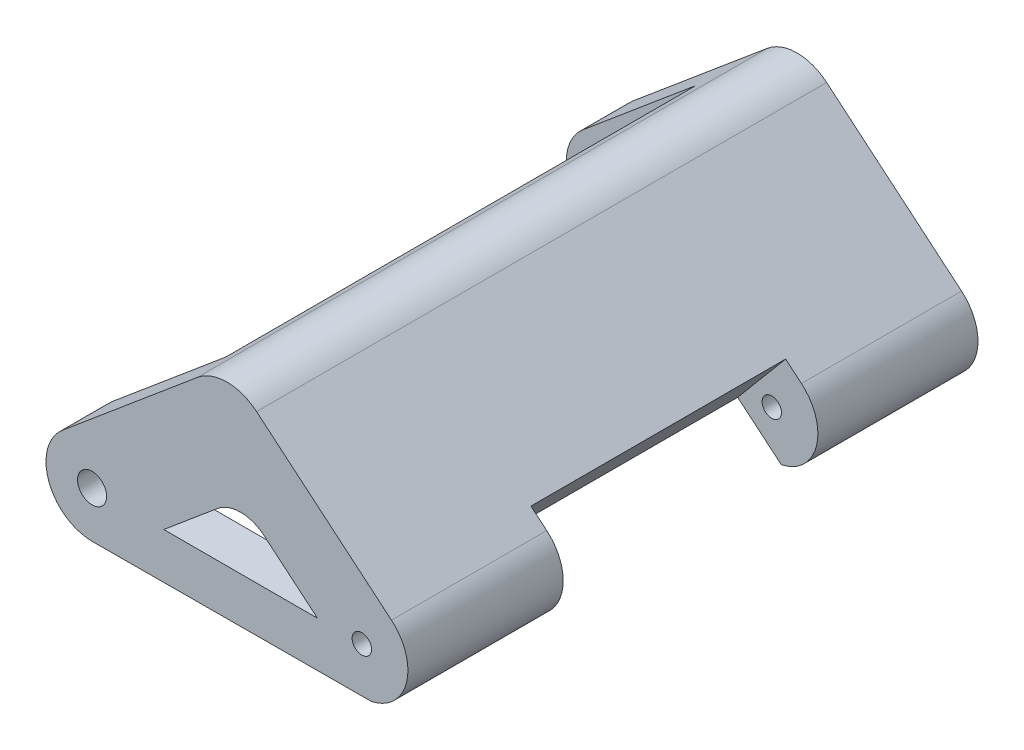
ISO-10303-21;
HEADER;
FILE_DESCRIPTION(('STEP AP214'),'2;1');
FILE_NAME('part.step','',(''),(''),'','','');
FILE_SCHEMA(('AUTOMOTIVE_DESIGN { 1 0 10303 214 1 1 1 1 }'));
ENDSEC;
DATA;
#1=APPLICATION_CONTEXT('core data for automotive mechanical design processes');
#2=APPLICATION_PROTOCOL_DEFINITION('international standard','automotive_design',2000,#1);
#3=PRODUCT_CONTEXT('',#1,'mechanical');
#4=PRODUCT('Part','Part','',(#3));
#5=PRODUCT_RELATED_PRODUCT_CATEGORY('part','',(#4));
#6=PRODUCT_DEFINITION_FORMATION('','',#4);
#7=PRODUCT_DEFINITION_CONTEXT('part definition',#1,'design');
#8=PRODUCT_DEFINITION('design','',#6,#7);
#9=PRODUCT_DEFINITION_SHAPE('','',#8);
#10=(LENGTH_UNIT() NAMED_UNIT(*) SI_UNIT(.MILLI.,.METRE.));
#11=(NAMED_UNIT(*) PLANE_ANGLE_UNIT() SI_UNIT($,.RADIAN.));
#12=(NAMED_UNIT(*) SI_UNIT($,.STERADIAN.) SOLID_ANGLE_UNIT());
#13=UNCERTAINTY_MEASURE_WITH_UNIT(LENGTH_MEASURE(1.E-05),#10,'distance_accuracy_value','');
#14=(GEOMETRIC_REPRESENTATION_CONTEXT(3) GLOBAL_UNCERTAINTY_ASSIGNED_CONTEXT((#13)) GLOBAL_UNIT_ASSIGNED_CONTEXT((#10,
#11,#12)) REPRESENTATION_CONTEXT('',''));
#15=CARTESIAN_POINT('',(0.,0.,0.));
#16=DIRECTION('',(0.,0.,1.));
#17=DIRECTION('',(1.,0.,0.));
#18=AXIS2_PLACEMENT_3D('',#15,#16,#17);
#19=CARTESIAN_POINT('',(0.,0.,3.5));
#20=DIRECTION('',(0.,0.,1.));
#21=DIRECTION('',(-1.,0.,0.));
#22=AXIS2_PLACEMENT_3D('',#19,#20,#21);
#23=PLANE('',#22);
#24=CARTESIAN_POINT('',(5.5,-3.78075768376784,3.5));
#25=DIRECTION('',(0.,0.,1.));
#26=DIRECTION('',(1.,0.,0.));
#27=AXIS2_PLACEMENT_3D('',#24,#25,#26);
#28=CIRCLE('',#27,3.5);
#29=CARTESIAN_POINT('',(8.99997852787349,-3.76849781327332,3.5));
#30=VERTEX_POINT('',#29);
#31=CARTESIAN_POINT('',(5.57616870913514,-0.281586592245066,3.5));
#32=VERTEX_POINT('',#31);
#33=EDGE_CURVE('E231',#30,#32,#28,.T.);
#34=ORIENTED_EDGE('',*,*,#33,.F.);
#35=DIRECTION('',(0.999993865106711,0.00350282014129118,0.));
#36=VECTOR('',#35,1.);
#37=CARTESIAN_POINT('',(0.0133107165369074,-3.7999766874055,3.5));
#38=LINE('',#37,#36);
#39=CARTESIAN_POINT('',(23.0185341781441,-3.71939303293716,3.5));
#40=VERTEX_POINT('',#39);
#41=EDGE_CURVE('E237',#30,#40,#38,.T.);
#42=ORIENTED_EDGE('',*,*,#41,.T.);
#43=DIRECTION('',(-0.766044443118977,0.64278760968654,0.));
#44=VECTOR('',#43,1.);
#45=CARTESIAN_POINT('',(23.0185341781441,-3.71939303293716,3.5));
#46=LINE('',#45,#44);
#47=CARTESIAN_POINT('',(18.5859341688714,0.,3.5));
#48=VERTEX_POINT('',#47);
#49=EDGE_CURVE('E440',#40,#48,#46,.T.);
#50=ORIENTED_EDGE('',*,*,#49,.T.);
#51=DIRECTION('',(-1.,0.,0.));
#52=VECTOR('',#51,1.);
#53=CARTESIAN_POINT('',(18.5859341688714,0.,3.5));
#54=LINE('',#53,#52);
#55=CARTESIAN_POINT('',(5.91175054206955,0.,3.5));
#56=VERTEX_POINT('',#55);
#57=EDGE_CURVE('E433',#48,#56,#54,.T.);
#58=ORIENTED_EDGE('',*,*,#57,.T.);
#59=DIRECTION('',(0.766044443118977,0.642787609686541,0.));
#60=VECTOR('',#59,1.);
#61=CARTESIAN_POINT('',(2.44259291680885,-2.91096888385211,3.5));
#62=LINE('',#61,#60);
#63=EDGE_CURVE('E419',#32,#56,#62,.T.);
#64=ORIENTED_EDGE('',*,*,#63,.F.);
#65=EDGE_LOOP('',(#34,#42,#50,#58,#64));
#66=FACE_BOUND('',#65,.T.);
#67=ADVANCED_FACE('F45',(#66),#23,.T.);
#68=CARTESIAN_POINT('',(2.44259291680885,-2.91096888385211,47.));
#69=DIRECTION('',(-0.642787609686541,0.766044443118977,0.));
#70=DIRECTION('',(-0.766044443118977,-0.642787609686541,0.));
#71=AXIS2_PLACEMENT_3D('',#68,#69,#70);
#72=PLANE('',#71);
#73=DIRECTION('',(-0.766044443118977,-0.642787609686541,0.));
#74=VECTOR('',#73,1.);
#75=CARTESIAN_POINT('',(2.44259291680885,-2.91096888385211,4.10000000000001));
#76=LINE('',#75,#74);
#77=CARTESIAN_POINT('',(10.3204795264109,3.69936286472139,4.10000000000001));
#78=VERTEX_POINT('',#77);
#79=CARTESIAN_POINT('',(5.57616870913514,-0.281586592245066,4.1));
#80=VERTEX_POINT('',#79);
#81=EDGE_CURVE('E260',#78,#80,#76,.T.);
#82=ORIENTED_EDGE('',*,*,#81,.T.);
#83=DIRECTION('',(0.,0.,1.));
#84=VECTOR('',#83,1.);
#85=CARTESIAN_POINT('',(5.57616870913514,-0.281586592245066,2.1));
#86=LINE('',#85,#84);
#87=EDGE_CURVE('E447',#80,#32,#86,.F.);
#88=ORIENTED_EDGE('',*,*,#87,.T.);
#89=ORIENTED_EDGE('',*,*,#63,.T.);
#90=DIRECTION('',(0.,0.,-1.));
#91=VECTOR('',#90,1.);
#92=CARTESIAN_POINT('',(5.91175054206955,0.,3.5));
#93=LINE('',#92,#91);
#94=CARTESIAN_POINT('',(5.91175054206955,0.,0.));
#95=VERTEX_POINT('',#94);
#96=EDGE_CURVE('E422',#56,#95,#93,.T.);
#97=ORIENTED_EDGE('',*,*,#96,.T.);
#98=DIRECTION('',(0.766044443118977,0.642787609686541,0.));
#99=VECTOR('',#98,1.);
#100=CARTESIAN_POINT('',(2.44259291680885,-2.91096888385211,0.));
#101=LINE('',#100,#99);
#102=CARTESIAN_POINT('',(10.3204795264109,3.69936286472139,0.));
#103=VERTEX_POINT('',#102);
#104=EDGE_CURVE('E298',#95,#103,#101,.T.);
#105=ORIENTED_EDGE('',*,*,#104,.T.);
#106=DIRECTION('',(0.,0.,1.));
#107=VECTOR('',#106,1.);
#108=CARTESIAN_POINT('',(10.3204795264109,3.69936286472138,47.));
#109=LINE('',#108,#107);
#110=EDGE_CURVE('E251',#103,#78,#109,.T.);
#111=ORIENTED_EDGE('',*,*,#110,.T.);
#112=EDGE_LOOP('',(#82,#88,#89,#97,#105,#111));
#113=FACE_BOUND('',#112,.T.);
#114=ADVANCED_FACE('F492',(#113),#72,.F.);
#115=CARTESIAN_POINT('',(0.,0.,47.));
#116=DIRECTION('',(0.,0.,-1.));
#117=DIRECTION('',(-1.,0.,0.));
#118=AXIS2_PLACEMENT_3D('',#115,#116,#117);
#119=CYLINDRICAL_SURFACE('',#118,3.8);
#120=CARTESIAN_POINT('',(0.,0.,3.5));
#121=DIRECTION('',(0.,0.,1.));
#122=DIRECTION('',(1.,0.,0.));
#123=AXIS2_PLACEMENT_3D('',#120,#121,#122);
#124=CIRCLE('',#123,3.8);
#125=CARTESIAN_POINT('',(0.0133107165369074,-3.7999766874055,3.5));
#126=VERTEX_POINT('',#125);
#127=CARTESIAN_POINT('',(2.04841398403399,-3.20062496241187,3.5));
#128=VERTEX_POINT('',#127);
#129=EDGE_CURVE('E410',#126,#128,#124,.T.);
#130=ORIENTED_EDGE('',*,*,#129,.T.);
#131=DIRECTION('',(0.,0.,1.));
#132=VECTOR('',#131,1.);
#133=CARTESIAN_POINT('',(2.04841398403399,-3.20062496241187,3.1));
#134=LINE('',#133,#132);
#135=CARTESIAN_POINT('',(2.04841398403399,-3.20062496241187,4.1));
#136=VERTEX_POINT('',#135);
#137=EDGE_CURVE('E437',#128,#136,#134,.T.);
#138=ORIENTED_EDGE('',*,*,#137,.T.);
#139=CARTESIAN_POINT('',(0.,0.,4.10000000000001));
#140=DIRECTION('',(0.,0.,-1.));
#141=DIRECTION('',(-1.,0.,0.));
#142=AXIS2_PLACEMENT_3D('',#139,#140,#141);
#143=CIRCLE('',#142,3.8);
#144=CARTESIAN_POINT('',(-2.44259291680885,2.91096888385212,4.1));
#145=VERTEX_POINT('',#144);
#146=EDGE_CURVE('E348',#136,#145,#143,.T.);
#147=ORIENTED_EDGE('',*,*,#146,.T.);
#148=DIRECTION('',(0.,0.,-1.));
#149=VECTOR('',#148,1.);
#150=CARTESIAN_POINT('',(-2.44259291680885,2.91096888385211,47.));
#151=LINE('',#150,#149);
#152=CARTESIAN_POINT('',(-2.44259291680885,2.91096888385211,0.));
#153=VERTEX_POINT('',#152);
#154=EDGE_CURVE('E282',#145,#153,#151,.T.);
#155=ORIENTED_EDGE('',*,*,#154,.T.);
#156=CARTESIAN_POINT('',(0.,0.,0.));
#157=DIRECTION('',(0.,0.,1.));
#158=DIRECTION('',(1.,0.,0.));
#159=AXIS2_PLACEMENT_3D('',#156,#157,#158);
#160=CIRCLE('',#159,3.8);
#161=CARTESIAN_POINT('',(0.0133107165369074,-3.7999766874055,0.));
#162=VERTEX_POINT('',#161);
#163=EDGE_CURVE('E301',#153,#162,#160,.T.);
#164=ORIENTED_EDGE('',*,*,#163,.T.);
#165=DIRECTION('',(0.,0.,-1.));
#166=VECTOR('',#165,1.);
#167=CARTESIAN_POINT('',(0.0133107165369074,-3.7999766874055,3.5));
#168=LINE('',#167,#166);
#169=EDGE_CURVE('E421',#126,#162,#168,.T.);
#170=ORIENTED_EDGE('',*,*,#169,.F.);
#171=EDGE_LOOP('',(#130,#138,#147,#155,#164,#170));
#172=FACE_BOUND('',#171,.T.);
#173=ADVANCED_FACE('F457',(#172),#119,.T.);
#174=DIRECTION('',(0.766044443118977,0.642787609686541,0.));
#175=VECTOR('',#174,1.);
#176=CARTESIAN_POINT('',(2.44259291680885,-2.91096888385211,42.9));
#177=LINE('',#176,#175);
#178=CARTESIAN_POINT('',(2.44259291680885,-2.91096888385211,42.9));
#179=VERTEX_POINT('',#178);
#180=CARTESIAN_POINT('',(10.3204795264109,3.69936286472139,42.9));
#181=VERTEX_POINT('',#180);
#182=EDGE_CURVE('E265',#179,#181,#177,.T.);
#183=ORIENTED_EDGE('',*,*,#182,.T.);
#184=DIRECTION('',(0.,0.,1.));
#185=VECTOR('',#184,1.);
#186=CARTESIAN_POINT('',(10.3204795264109,3.69936286472138,47.));
#187=LINE('',#186,#185);
#188=CARTESIAN_POINT('',(10.3204795264109,3.69936286472139,47.));
#189=VERTEX_POINT('',#188);
#190=EDGE_CURVE('E254',#181,#189,#187,.T.);
#191=ORIENTED_EDGE('',*,*,#190,.T.);
#192=DIRECTION('',(0.766044443118977,0.642787609686541,0.));
#193=VECTOR('',#192,1.);
#194=CARTESIAN_POINT('',(2.44259291680885,-2.91096888385211,47.));
#195=LINE('',#194,#193);
#196=CARTESIAN_POINT('',(5.91175054206955,0.,47.));
#197=VERTEX_POINT('',#196);
#198=EDGE_CURVE('E320',#197,#189,#195,.T.);
#199=ORIENTED_EDGE('',*,*,#198,.F.);
#200=DIRECTION('',(0.,0.,1.));
#201=VECTOR('',#200,1.);
#202=CARTESIAN_POINT('',(5.91175054206955,0.,43.5));
#203=LINE('',#202,#201);
#204=CARTESIAN_POINT('',(5.91175054206955,0.,43.5));
#205=VERTEX_POINT('',#204);
#206=EDGE_CURVE('E391',#205,#197,#203,.T.);
#207=ORIENTED_EDGE('',*,*,#206,.F.);
#208=DIRECTION('',(-0.766044443118977,-0.642787609686541,0.));
#209=VECTOR('',#208,1.);
#210=CARTESIAN_POINT('',(2.44259291680885,-2.91096888385211,43.5));
#211=LINE('',#210,#209);
#212=CARTESIAN_POINT('',(2.44259291680885,-2.91096888385211,43.5));
#213=VERTEX_POINT('',#212);
#214=EDGE_CURVE('E388',#205,#213,#211,.T.);
#215=ORIENTED_EDGE('',*,*,#214,.T.);
#216=DIRECTION('',(0.,0.,-1.));
#217=VECTOR('',#216,1.);
#218=CARTESIAN_POINT('',(2.44259291680885,-2.91096888385211,47.));
#219=LINE('',#218,#217);
#220=EDGE_CURVE('E283',#213,#179,#219,.T.);
#221=ORIENTED_EDGE('',*,*,#220,.T.);
#222=EDGE_LOOP('',(#183,#191,#199,#207,#215,#221));
#223=FACE_BOUND('',#222,.T.);
#224=ADVANCED_FACE('F500',(#223),#72,.F.);
#225=CARTESIAN_POINT('',(23.0185341781441,-3.71939303293716,0.));
#226=DIRECTION('',(0.64278760968654,0.766044443118977,0.));
#227=DIRECTION('',(-0.766044443118977,0.64278760968654,0.));
#228=AXIS2_PLACEMENT_3D('',#225,#226,#227);
#229=PLANE('',#228);
#230=DIRECTION('',(-0.766044443118977,0.64278760968654,0.));
#231=VECTOR('',#230,1.);
#232=CARTESIAN_POINT('',(23.0185341781441,-3.71939303293716,47.));
#233=LINE('',#232,#231);
#234=CARTESIAN_POINT('',(18.5859341688714,0.,47.));
#235=VERTEX_POINT('',#234);
#236=CARTESIAN_POINT('',(14.1772051845301,3.69936286472139,47.));
#237=VERTEX_POINT('',#236);
#238=EDGE_CURVE('E374',#235,#237,#233,.T.);
#239=ORIENTED_EDGE('',*,*,#238,.T.);
#240=DIRECTION('',(0.,0.,1.));
#241=VECTOR('',#240,1.);
#242=CARTESIAN_POINT('',(14.1772051845301,3.69936286472139,0.));
#243=LINE('',#242,#241);
#244=CARTESIAN_POINT('',(14.1772051845301,3.69936286472139,0.));
#245=VERTEX_POINT('',#244);
#246=EDGE_CURVE('E249',#237,#245,#243,.F.);
#247=ORIENTED_EDGE('',*,*,#246,.T.);
#248=DIRECTION('',(-0.766044443118977,0.64278760968654,0.));
#249=VECTOR('',#248,1.);
#250=CARTESIAN_POINT('',(23.0185341781441,-3.71939303293716,0.));
#251=LINE('',#250,#249);
#252=CARTESIAN_POINT('',(18.5859341688714,0.,0.));
#253=VERTEX_POINT('',#252);
#254=EDGE_CURVE('E373',#253,#245,#251,.T.);
#255=ORIENTED_EDGE('',*,*,#254,.F.);
#256=DIRECTION('',(0.,0.,-1.));
#257=VECTOR('',#256,1.);
#258=CARTESIAN_POINT('',(18.5859341688714,0.,3.5));
#259=LINE('',#258,#257);
#260=EDGE_CURVE('E425',#48,#253,#259,.T.);
#261=ORIENTED_EDGE('',*,*,#260,.F.);
#262=ORIENTED_EDGE('',*,*,#49,.F.);
#263=DIRECTION('',(0.,0.,1.));
#264=VECTOR('',#263,1.);
#265=CARTESIAN_POINT('',(23.0185341781441,-3.71939303293716,0.));
#266=LINE('',#265,#264);
#267=CARTESIAN_POINT('',(23.0185341781441,-3.71939303293716,13.2));
#268=VERTEX_POINT('',#267);
#269=EDGE_CURVE('E362',#40,#268,#266,.T.);
#270=ORIENTED_EDGE('',*,*,#269,.T.);
#271=DIRECTION('',(0.766044443118977,-0.64278760968654,0.));
#272=VECTOR('',#271,1.);
#273=CARTESIAN_POINT('',(19.4279524674587,-0.706537243789098,13.2));
#274=LINE('',#273,#272);
#275=CARTESIAN_POINT('',(19.4279524674587,-0.706537243789098,13.2));
#276=VERTEX_POINT('',#275);
#277=EDGE_CURVE('E370',#276,#268,#274,.T.);
#278=ORIENTED_EDGE('',*,*,#277,.F.);
#279=DIRECTION('',(0.,0.,-1.));
#280=VECTOR('',#279,1.);
#281=CARTESIAN_POINT('',(19.4279524674587,-0.7065372437891,13.2));
#282=LINE('',#281,#280);
#283=CARTESIAN_POINT('',(19.4279524674587,-0.7065372437891,34.2));
#284=VERTEX_POINT('',#283);
#285=EDGE_CURVE('E367',#284,#276,#282,.T.);
#286=ORIENTED_EDGE('',*,*,#285,.F.);
#287=DIRECTION('',(-0.766044443118977,0.64278760968654,0.));
#288=VECTOR('',#287,1.);
#289=CARTESIAN_POINT('',(19.4279524674587,-0.706537243789098,34.2));
#290=LINE('',#289,#288);
#291=CARTESIAN_POINT('',(23.0185341781441,-3.71939303293716,34.2));
#292=VERTEX_POINT('',#291);
#293=EDGE_CURVE('E364',#292,#284,#290,.T.);
#294=ORIENTED_EDGE('',*,*,#293,.F.);
#295=CARTESIAN_POINT('',(23.0185341781441,-3.71939303293716,43.5));
#296=VERTEX_POINT('',#295);
#297=EDGE_CURVE('E363',#292,#296,#266,.T.);
#298=ORIENTED_EDGE('',*,*,#297,.T.);
#299=DIRECTION('',(-0.766044443118977,0.64278760968654,0.));
#300=VECTOR('',#299,1.);
#301=CARTESIAN_POINT('',(23.0185341781441,-3.71939303293716,43.5));
#302=LINE('',#301,#300);
#303=CARTESIAN_POINT('',(18.5859341688714,0.,43.5));
#304=VERTEX_POINT('',#303);
#305=EDGE_CURVE('E413',#296,#304,#302,.T.);
#306=ORIENTED_EDGE('',*,*,#305,.T.);
#307=DIRECTION('',(0.,0.,1.));
#308=VECTOR('',#307,1.);
#309=CARTESIAN_POINT('',(18.5859341688714,0.,43.5));
#310=LINE('',#309,#308);
#311=EDGE_CURVE('E399',#304,#235,#310,.T.);
#312=ORIENTED_EDGE('',*,*,#311,.T.);
#313=EDGE_LOOP('',(#239,#247,#255,#261,#262,#270,#278,#286,#294,#298,#306,#312));
#314=FACE_BOUND('',#313,.T.);
#315=ADVANCED_FACE('F539',(#314),#229,.F.);
#316=DIRECTION('',(0.,0.,1.));
#317=VECTOR('',#316,1.);
#318=CARTESIAN_POINT('',(0.0133107165369074,-3.7999766874055,43.5));
#319=LINE('',#318,#317);
#320=CARTESIAN_POINT('',(0.0133107165369074,-3.7999766874055,43.5));
#321=VERTEX_POINT('',#320);
#322=CARTESIAN_POINT('',(0.0133107165369074,-3.7999766874055,47.));
#323=VERTEX_POINT('',#322);
#324=EDGE_CURVE('E392',#321,#323,#319,.T.);
#325=ORIENTED_EDGE('',*,*,#324,.T.);
#326=CARTESIAN_POINT('',(0.,0.,47.));
#327=DIRECTION('',(0.,0.,1.));
#328=DIRECTION('',(1.,0.,0.));
#329=AXIS2_PLACEMENT_3D('',#326,#327,#328);
#330=CIRCLE('',#329,3.8);
#331=CARTESIAN_POINT('',(-2.44259291680885,2.91096888385211,47.));
#332=VERTEX_POINT('',#331);
#333=EDGE_CURVE('E323',#332,#323,#330,.T.);
#334=ORIENTED_EDGE('',*,*,#333,.F.);
#335=CARTESIAN_POINT('',(-2.44259291680885,2.91096888385212,42.9));
#336=VERTEX_POINT('',#335);
#337=EDGE_CURVE('E279',#332,#336,#151,.T.);
#338=ORIENTED_EDGE('',*,*,#337,.T.);
#339=CARTESIAN_POINT('',(0.,0.,42.9));
#340=DIRECTION('',(0.,0.,1.));
#341=DIRECTION('',(1.,0.,0.));
#342=AXIS2_PLACEMENT_3D('',#339,#340,#341);
#343=CIRCLE('',#342,3.8);
#344=EDGE_CURVE('E261',#336,#179,#343,.T.);
#345=ORIENTED_EDGE('',*,*,#344,.T.);
#346=ORIENTED_EDGE('',*,*,#220,.F.);
#347=CARTESIAN_POINT('',(0.,0.,43.5));
#348=DIRECTION('',(0.,0.,-1.));
#349=DIRECTION('',(-1.,0.,0.));
#350=AXIS2_PLACEMENT_3D('',#347,#348,#349);
#351=CIRCLE('',#350,3.8);
#352=EDGE_CURVE('E385',#213,#321,#351,.T.);
#353=ORIENTED_EDGE('',*,*,#352,.T.);
#354=EDGE_LOOP('',(#325,#334,#338,#345,#346,#353));
#355=FACE_BOUND('',#354,.T.);
#356=ADVANCED_FACE('F513',(#355),#119,.T.);
#357=CARTESIAN_POINT('',(0.,0.,47.));
#358=DIRECTION('',(0.,0.,-1.));
#359=DIRECTION('',(-1.,0.,0.));
#360=AXIS2_PLACEMENT_3D('',#357,#358,#359);
#361=CYLINDRICAL_SURFACE('',#360,1.2);
#362=CARTESIAN_POINT('',(0.,0.,4.10000000000001));
#363=DIRECTION('',(0.,0.,-1.));
#364=DIRECTION('',(-1.,0.,0.));
#365=AXIS2_PLACEMENT_3D('',#362,#363,#364);
#366=CIRCLE('',#365,1.2);
#367=CARTESIAN_POINT('',(-1.2,0.,4.10000000000001));
#368=VERTEX_POINT('',#367);
#369=EDGE_CURVE('E257',#368,#368,#366,.T.);
#370=ORIENTED_EDGE('',*,*,#369,.F.);
#371=EDGE_LOOP('',(#370));
#372=FACE_BOUND('',#371,.T.);
#373=CARTESIAN_POINT('',(0.,0.,0.));
#374=DIRECTION('',(0.,0.,1.));
#375=DIRECTION('',(1.,0.,0.));
#376=AXIS2_PLACEMENT_3D('',#373,#374,#375);
#377=CIRCLE('',#376,1.2);
#378=CARTESIAN_POINT('',(1.2,0.,0.));
#379=VERTEX_POINT('',#378);
#380=EDGE_CURVE('E293',#379,#379,#377,.T.);
#381=ORIENTED_EDGE('',*,*,#380,.F.);
#382=EDGE_LOOP('',(#381));
#383=FACE_BOUND('',#382,.T.);
#384=ADVANCED_FACE('F591',(#372,#383),#361,.F.);
#385=CARTESIAN_POINT('',(22.24,0.,47.));
#386=DIRECTION('',(0.,0.,-1.));
#387=DIRECTION('',(-1.,0.,0.));
#388=AXIS2_PLACEMENT_3D('',#385,#386,#387);
#389=CYLINDRICAL_SURFACE('',#388,3.8);
#390=CARTESIAN_POINT('',(22.24,0.,47.));
#391=DIRECTION('',(0.,0.,1.));
#392=DIRECTION('',(1.,0.,0.));
#393=AXIS2_PLACEMENT_3D('',#390,#391,#392);
#394=CIRCLE('',#393,3.8);
#395=CARTESIAN_POINT('',(23.0185341781441,-3.71939303293716,47.));
#396=VERTEX_POINT('',#395);
#397=CARTESIAN_POINT('',(24.6825929168089,2.91096888385211,47.));
#398=VERTEX_POINT('',#397);
#399=EDGE_CURVE('E318',#396,#398,#394,.T.);
#400=ORIENTED_EDGE('',*,*,#399,.F.);
#401=DIRECTION('',(0.,0.,1.));
#402=VECTOR('',#401,1.);
#403=CARTESIAN_POINT('',(23.0185341781441,-3.71939303293716,43.5));
#404=LINE('',#403,#402);
#405=EDGE_CURVE('E395',#296,#396,#404,.T.);
#406=ORIENTED_EDGE('',*,*,#405,.F.);
#407=ORIENTED_EDGE('',*,*,#297,.F.);
#408=CARTESIAN_POINT('',(22.24,0.,34.2));
#409=DIRECTION('',(0.,0.,1.));
#410=DIRECTION('',(1.,0.,0.));
#411=AXIS2_PLACEMENT_3D('',#408,#409,#410);
#412=CIRCLE('',#411,3.8);
#413=CARTESIAN_POINT('',(24.6825929168089,2.91096888385211,34.2));
#414=VERTEX_POINT('',#413);
#415=EDGE_CURVE('E270',#292,#414,#412,.T.);
#416=ORIENTED_EDGE('',*,*,#415,.T.);
#417=DIRECTION('',(0.,0.,-1.));
#418=VECTOR('',#417,1.);
#419=CARTESIAN_POINT('',(24.6825929168089,2.91096888385211,47.));
#420=LINE('',#419,#418);
#421=EDGE_CURVE('E285',#398,#414,#420,.T.);
#422=ORIENTED_EDGE('',*,*,#421,.F.);
#423=EDGE_LOOP('',(#400,#406,#407,#416,#422));
#424=FACE_BOUND('',#423,.T.);
#425=ADVANCED_FACE('F593',(#424),#389,.T.);
#426=CARTESIAN_POINT('',(22.24,0.,47.));
#427=DIRECTION('',(0.,0.,-1.));
#428=DIRECTION('',(-1.,0.,0.));
#429=AXIS2_PLACEMENT_3D('',#426,#427,#428);
#430=CYLINDRICAL_SURFACE('',#429,0.799999999999999);
#431=CARTESIAN_POINT('',(22.24,0.,34.2));
#432=DIRECTION('',(0.,0.,1.));
#433=DIRECTION('',(1.,0.,0.));
#434=AXIS2_PLACEMENT_3D('',#431,#432,#433);
#435=CIRCLE('',#434,0.799999999999999);
#436=CARTESIAN_POINT('',(23.04,0.,34.2));
#437=VERTEX_POINT('',#436);
#438=EDGE_CURVE('E267',#437,#437,#435,.T.);
#439=ORIENTED_EDGE('',*,*,#438,.F.);
#440=EDGE_LOOP('',(#439));
#441=FACE_BOUND('',#440,.T.);
#442=CARTESIAN_POINT('',(22.24,0.,47.));
#443=DIRECTION('',(0.,0.,1.));
#444=DIRECTION('',(1.,0.,0.));
#445=AXIS2_PLACEMENT_3D('',#442,#443,#444);
#446=CIRCLE('',#445,0.799999999999999);
#447=CARTESIAN_POINT('',(23.04,0.,47.));
#448=VERTEX_POINT('',#447);
#449=EDGE_CURVE('E312',#448,#448,#446,.T.);
#450=ORIENTED_EDGE('',*,*,#449,.T.);
#451=EDGE_LOOP('',(#450));
#452=FACE_BOUND('',#451,.T.);
#453=ADVANCED_FACE('F586',(#441,#452),#430,.F.);
#454=CARTESIAN_POINT('',(11.6316251811526,13.8620310973479,47.));
#455=DIRECTION('',(0.64278760968654,0.766044443118977,0.));
#456=DIRECTION('',(-0.766044443118977,0.64278760968654,0.));
#457=AXIS2_PLACEMENT_3D('',#454,#455,#456);
#458=PLANE('',#457);
#459=DIRECTION('',(0.766044443118977,-0.64278760968654,0.));
#460=VECTOR('',#459,1.);
#461=CARTESIAN_POINT('',(23.3803173635066,4.00370782031923,34.2));
#462=LINE('',#461,#460);
#463=CARTESIAN_POINT('',(23.3803173635066,4.00370782031923,34.2));
#464=VERTEX_POINT('',#463);
#465=EDGE_CURVE('E338',#464,#414,#462,.T.);
#466=ORIENTED_EDGE('',*,*,#465,.F.);
#467=DIRECTION('',(0.,0.,1.));
#468=VECTOR('',#467,1.);
#469=CARTESIAN_POINT('',(23.3803173635066,4.00370782031923,13.2));
#470=LINE('',#469,#468);
#471=CARTESIAN_POINT('',(23.3803173635066,4.00370782031923,13.2));
#472=VERTEX_POINT('',#471);
#473=EDGE_CURVE('E342',#472,#464,#470,.T.);
#474=ORIENTED_EDGE('',*,*,#473,.F.);
#475=DIRECTION('',(-0.766044443118977,0.64278760968654,0.));
#476=VECTOR('',#475,1.);
#477=CARTESIAN_POINT('',(23.3803173635066,4.00370782031923,13.2));
#478=LINE('',#477,#476);
#479=CARTESIAN_POINT('',(24.6825929168089,2.91096888385211,13.2));
#480=VERTEX_POINT('',#479);
#481=EDGE_CURVE('E345',#480,#472,#478,.T.);
#482=ORIENTED_EDGE('',*,*,#481,.F.);
#483=CARTESIAN_POINT('',(24.6825929168089,2.91096888385211,0.));
#484=VERTEX_POINT('',#483);
#485=EDGE_CURVE('E288',#480,#484,#420,.T.);
#486=ORIENTED_EDGE('',*,*,#485,.T.);
#487=DIRECTION('',(0.766044443118977,-0.64278760968654,0.));
#488=VECTOR('',#487,1.);
#489=CARTESIAN_POINT('',(11.6316251811526,13.8620310973479,0.));
#490=LINE('',#489,#488);
#491=CARTESIAN_POINT('',(13.5625929168089,12.2417567825435,0.));
#492=VERTEX_POINT('',#491);
#493=EDGE_CURVE('E309',#492,#484,#490,.T.);
#494=ORIENTED_EDGE('',*,*,#493,.F.);
#495=DIRECTION('',(0.,0.,-1.));
#496=VECTOR('',#495,1.);
#497=CARTESIAN_POINT('',(13.5625929168089,12.2417567825435,47.));
#498=LINE('',#497,#496);
#499=CARTESIAN_POINT('',(13.5625929168089,12.2417567825435,47.));
#500=VERTEX_POINT('',#499);
#501=EDGE_CURVE('E256',#500,#492,#498,.T.);
#502=ORIENTED_EDGE('',*,*,#501,.F.);
#503=DIRECTION('',(0.766044443118977,-0.64278760968654,0.));
#504=VECTOR('',#503,1.);
#505=CARTESIAN_POINT('',(11.6316251811526,13.8620310973479,47.));
#506=LINE('',#505,#504);
#507=EDGE_CURVE('E292',#500,#398,#506,.T.);
#508=ORIENTED_EDGE('',*,*,#507,.T.);
#509=ORIENTED_EDGE('',*,*,#421,.T.);
#510=EDGE_LOOP('',(#466,#474,#482,#486,#494,#502,#508,#509));
#511=FACE_BOUND('',#510,.T.);
#512=ADVANCED_FACE('F529',(#511),#458,.T.);
#513=CARTESIAN_POINT('',(11.12,9.33078789869139,47.));
#514=DIRECTION('',(0.,0.,-1.));
#515=DIRECTION('',(-1.,0.,0.));
#516=AXIS2_PLACEMENT_3D('',#513,#514,#515);
#517=CYLINDRICAL_SURFACE('',#516,3.8);
#518=CARTESIAN_POINT('',(11.12,9.33078789869139,0.));
#519=DIRECTION('',(0.,0.,1.));
#520=DIRECTION('',(1.,0.,0.));
#521=AXIS2_PLACEMENT_3D('',#518,#519,#520);
#522=CIRCLE('',#521,3.8);
#523=CARTESIAN_POINT('',(8.67740708319115,12.2417567825435,0.));
#524=VERTEX_POINT('',#523);
#525=EDGE_CURVE('E306',#492,#524,#522,.T.);
#526=ORIENTED_EDGE('',*,*,#525,.T.);
#527=DIRECTION('',(0.,0.,-1.));
#528=VECTOR('',#527,1.);
#529=CARTESIAN_POINT('',(8.67740708319115,12.2417567825435,47.));
#530=LINE('',#529,#528);
#531=CARTESIAN_POINT('',(8.67740708319115,12.2417567825435,47.));
#532=VERTEX_POINT('',#531);
#533=EDGE_CURVE('E277',#532,#524,#530,.T.);
#534=ORIENTED_EDGE('',*,*,#533,.F.);
#535=CARTESIAN_POINT('',(11.12,9.33078789869139,47.));
#536=DIRECTION('',(0.,0.,1.));
#537=DIRECTION('',(1.,0.,0.));
#538=AXIS2_PLACEMENT_3D('',#535,#536,#537);
#539=CIRCLE('',#538,3.8);
#540=EDGE_CURVE('E329',#500,#532,#539,.T.);
#541=ORIENTED_EDGE('',*,*,#540,.F.);
#542=ORIENTED_EDGE('',*,*,#501,.T.);
#543=EDGE_LOOP('',(#526,#534,#541,#542));
#544=FACE_BOUND('',#543,.T.);
#545=ADVANCED_FACE('F524',(#544),#517,.T.);
#546=CARTESIAN_POINT('',(-2.44259291680885,2.91096888385211,47.));
#547=DIRECTION('',(-0.642787609686541,0.766044443118977,0.));
#548=DIRECTION('',(-0.766044443118977,-0.642787609686541,0.));
#549=AXIS2_PLACEMENT_3D('',#546,#547,#548);
#550=PLANE('',#549);
#551=DIRECTION('',(-0.766044443118977,-0.642787609686541,0.));
#552=VECTOR('',#551,1.);
#553=CARTESIAN_POINT('',(6.13710484612369,10.1101901123414,4.1));
#554=LINE('',#553,#552);
#555=CARTESIAN_POINT('',(6.90314928924267,10.7529777220279,4.1));
#556=VERTEX_POINT('',#555);
#557=EDGE_CURVE('E266',#556,#145,#554,.T.);
#558=ORIENTED_EDGE('',*,*,#557,.F.);
#559=DIRECTION('',(0.,0.,-1.));
#560=VECTOR('',#559,1.);
#561=CARTESIAN_POINT('',(6.90314928924267,10.7529777220279,4.1));
#562=LINE('',#561,#560);
#563=CARTESIAN_POINT('',(6.90314928924267,10.7529777220279,42.9));
#564=VERTEX_POINT('',#563);
#565=EDGE_CURVE('E377',#564,#556,#562,.T.);
#566=ORIENTED_EDGE('',*,*,#565,.F.);
#567=DIRECTION('',(0.766044443118977,0.642787609686541,0.));
#568=VECTOR('',#567,1.);
#569=CARTESIAN_POINT('',(6.13710484612369,10.1101901123414,42.9));
#570=LINE('',#569,#568);
#571=EDGE_CURVE('E358',#336,#564,#570,.T.);
#572=ORIENTED_EDGE('',*,*,#571,.F.);
#573=ORIENTED_EDGE('',*,*,#337,.F.);
#574=DIRECTION('',(0.766044443118977,0.642787609686541,0.));
#575=VECTOR('',#574,1.);
#576=CARTESIAN_POINT('',(-2.44259291680885,2.91096888385211,47.));
#577=LINE('',#576,#575);
#578=EDGE_CURVE('E326',#332,#532,#577,.T.);
#579=ORIENTED_EDGE('',*,*,#578,.T.);
#580=ORIENTED_EDGE('',*,*,#533,.T.);
#581=DIRECTION('',(0.766044443118977,0.642787609686541,0.));
#582=VECTOR('',#581,1.);
#583=CARTESIAN_POINT('',(-2.44259291680885,2.91096888385211,0.));
#584=LINE('',#583,#582);
#585=EDGE_CURVE('E303',#153,#524,#584,.T.);
#586=ORIENTED_EDGE('',*,*,#585,.F.);
#587=ORIENTED_EDGE('',*,*,#154,.F.);
#588=EDGE_LOOP('',(#558,#566,#572,#573,#579,#580,#586,#587));
#589=FACE_BOUND('',#588,.T.);
#590=ADVANCED_FACE('F465',(#589),#550,.T.);
#591=CARTESIAN_POINT('',(0.,0.,42.9));
#592=DIRECTION('',(0.,0.,1.));
#593=DIRECTION('',(1.,0.,0.));
#594=AXIS2_PLACEMENT_3D('',#591,#592,#593);
#595=CIRCLE('',#594,1.2);
#596=CARTESIAN_POINT('',(1.2,0.,42.9));
#597=VERTEX_POINT('',#596);
#598=EDGE_CURVE('E262',#597,#597,#595,.T.);
#599=ORIENTED_EDGE('',*,*,#598,.F.);
#600=EDGE_LOOP('',(#599));
#601=FACE_BOUND('',#600,.T.);
#602=CARTESIAN_POINT('',(0.,0.,47.));
#603=DIRECTION('',(0.,0.,1.));
#604=DIRECTION('',(1.,0.,0.));
#605=AXIS2_PLACEMENT_3D('',#602,#603,#604);
#606=CIRCLE('',#605,1.2);
#607=CARTESIAN_POINT('',(1.2,0.,47.));
#608=VERTEX_POINT('',#607);
#609=EDGE_CURVE('E315',#608,#608,#606,.T.);
#610=ORIENTED_EDGE('',*,*,#609,.T.);
#611=EDGE_LOOP('',(#610));
#612=FACE_BOUND('',#611,.T.);
#613=ADVANCED_FACE('F587',(#601,#612),#361,.F.);
#614=CARTESIAN_POINT('',(22.24,0.,13.2));
#615=DIRECTION('',(0.,0.,-1.));
#616=DIRECTION('',(-1.,0.,0.));
#617=AXIS2_PLACEMENT_3D('',#614,#615,#616);
#618=CIRCLE('',#617,3.8);
#619=EDGE_CURVE('E271',#480,#268,#618,.T.);
#620=ORIENTED_EDGE('',*,*,#619,.T.);
#621=ORIENTED_EDGE('',*,*,#269,.F.);
#622=CARTESIAN_POINT('',(23.0185341781441,-3.71939303293716,0.));
#623=VERTEX_POINT('',#622);
#624=EDGE_CURVE('E360',#623,#40,#266,.T.);
#625=ORIENTED_EDGE('',*,*,#624,.F.);
#626=CARTESIAN_POINT('',(22.24,0.,0.));
#627=DIRECTION('',(0.,0.,1.));
#628=DIRECTION('',(1.,0.,0.));
#629=AXIS2_PLACEMENT_3D('',#626,#627,#628);
#630=CIRCLE('',#629,3.8);
#631=EDGE_CURVE('E296',#623,#484,#630,.T.);
#632=ORIENTED_EDGE('',*,*,#631,.T.);
#633=ORIENTED_EDGE('',*,*,#485,.F.);
#634=EDGE_LOOP('',(#620,#621,#625,#632,#633));
#635=FACE_BOUND('',#634,.T.);
#636=ADVANCED_FACE('F534',(#635),#389,.T.);
#637=CARTESIAN_POINT('',(22.24,0.,13.2));
#638=DIRECTION('',(0.,0.,-1.));
#639=DIRECTION('',(-1.,0.,0.));
#640=AXIS2_PLACEMENT_3D('',#637,#638,#639);
#641=CIRCLE('',#640,0.799999999999999);
#642=CARTESIAN_POINT('',(21.44,0.,13.2));
#643=VERTEX_POINT('',#642);
#644=EDGE_CURVE('E272',#643,#643,#641,.T.);
#645=ORIENTED_EDGE('',*,*,#644,.F.);
#646=EDGE_LOOP('',(#645));
#647=FACE_BOUND('',#646,.T.);
#648=CARTESIAN_POINT('',(22.24,0.,0.));
#649=DIRECTION('',(0.,0.,1.));
#650=DIRECTION('',(1.,0.,0.));
#651=AXIS2_PLACEMENT_3D('',#648,#649,#650);
#652=CIRCLE('',#651,0.799999999999999);
#653=CARTESIAN_POINT('',(23.04,0.,0.));
#654=VERTEX_POINT('',#653);
#655=EDGE_CURVE('E289',#654,#654,#652,.T.);
#656=ORIENTED_EDGE('',*,*,#655,.F.);
#657=EDGE_LOOP('',(#656));
#658=FACE_BOUND('',#657,.T.);
#659=ADVANCED_FACE('F581',(#647,#658),#430,.F.);
#660=CARTESIAN_POINT('',(0.,0.,47.));
#661=DIRECTION('',(0.,0.,1.));
#662=DIRECTION('',(1.,0.,0.));
#663=AXIS2_PLACEMENT_3D('',#660,#661,#662);
#664=PLANE('',#663);
#665=ORIENTED_EDGE('',*,*,#333,.T.);
#666=DIRECTION('',(0.999993865106711,0.00350282014129118,0.));
#667=VECTOR('',#666,1.);
#668=CARTESIAN_POINT('',(0.0133107165369074,-3.7999766874055,47.));
#669=LINE('',#668,#667);
#670=EDGE_CURVE('E407',#323,#396,#669,.T.);
#671=ORIENTED_EDGE('',*,*,#670,.T.);
#672=ORIENTED_EDGE('',*,*,#399,.T.);
#673=ORIENTED_EDGE('',*,*,#507,.F.);
#674=ORIENTED_EDGE('',*,*,#540,.T.);
#675=ORIENTED_EDGE('',*,*,#578,.F.);
#676=EDGE_LOOP('',(#665,#671,#672,#673,#674,#675));
#677=FACE_BOUND('',#676,.T.);
#678=DIRECTION('',(-1.,0.,0.));
#679=VECTOR('',#678,1.);
#680=CARTESIAN_POINT('',(18.5859341688714,0.,47.));
#681=LINE('',#680,#679);
#682=EDGE_CURVE('E404',#235,#197,#681,.T.);
#683=ORIENTED_EDGE('',*,*,#682,.T.);
#684=ORIENTED_EDGE('',*,*,#198,.T.);
#685=CARTESIAN_POINT('',(12.2488423554705,1.40122953536445,47.));
#686=DIRECTION('',(0.,0.,1.));
#687=DIRECTION('',(1.,0.,0.));
#688=AXIS2_PLACEMENT_3D('',#685,#686,#687);
#689=CIRCLE('',#688,3.);
#690=EDGE_CURVE('E240',#189,#237,#689,.F.);
#691=ORIENTED_EDGE('',*,*,#690,.T.);
#692=ORIENTED_EDGE('',*,*,#238,.F.);
#693=EDGE_LOOP('',(#683,#684,#691,#692));
#694=FACE_BOUND('',#693,.T.);
#695=ORIENTED_EDGE('',*,*,#609,.F.);
#696=EDGE_LOOP('',(#695));
#697=FACE_BOUND('',#696,.T.);
#698=ORIENTED_EDGE('',*,*,#449,.F.);
#699=EDGE_LOOP('',(#698));
#700=FACE_BOUND('',#699,.T.);
#701=ADVANCED_FACE('F518',(#677,#694,#697,#700),#664,.T.);
#702=CARTESIAN_POINT('',(0.,0.,0.));
#703=DIRECTION('',(0.,0.,1.));
#704=DIRECTION('',(1.,0.,0.));
#705=AXIS2_PLACEMENT_3D('',#702,#703,#704);
#706=PLANE('',#705);
#707=ORIENTED_EDGE('',*,*,#104,.F.);
#708=DIRECTION('',(-1.,0.,0.));
#709=VECTOR('',#708,1.);
#710=CARTESIAN_POINT('',(18.5859341688714,0.,0.));
#711=LINE('',#710,#709);
#712=EDGE_CURVE('E434',#253,#95,#711,.T.);
#713=ORIENTED_EDGE('',*,*,#712,.F.);
#714=ORIENTED_EDGE('',*,*,#254,.T.);
#715=CARTESIAN_POINT('',(12.2488423554705,1.40122953536445,0.));
#716=DIRECTION('',(0.,0.,1.));
#717=DIRECTION('',(1.,0.,0.));
#718=AXIS2_PLACEMENT_3D('',#715,#716,#717);
#719=CIRCLE('',#718,3.);
#720=EDGE_CURVE('E226',#245,#103,#719,.T.);
#721=ORIENTED_EDGE('',*,*,#720,.T.);
#722=EDGE_LOOP('',(#707,#713,#714,#721));
#723=FACE_BOUND('',#722,.T.);
#724=DIRECTION('',(0.999993865106711,0.00350282014129118,0.));
#725=VECTOR('',#724,1.);
#726=CARTESIAN_POINT('',(0.0133107165369074,-3.7999766874055,0.));
#727=LINE('',#726,#725);
#728=EDGE_CURVE('E431',#162,#623,#727,.T.);
#729=ORIENTED_EDGE('',*,*,#728,.F.);
#730=ORIENTED_EDGE('',*,*,#163,.F.);
#731=ORIENTED_EDGE('',*,*,#585,.T.);
#732=ORIENTED_EDGE('',*,*,#525,.F.);
#733=ORIENTED_EDGE('',*,*,#493,.T.);
#734=ORIENTED_EDGE('',*,*,#631,.F.);
#735=EDGE_LOOP('',(#729,#730,#731,#732,#733,#734));
#736=FACE_BOUND('',#735,.T.);
#737=ORIENTED_EDGE('',*,*,#655,.T.);
#738=EDGE_LOOP('',(#737));
#739=FACE_BOUND('',#738,.T.);
#740=ORIENTED_EDGE('',*,*,#380,.T.);
#741=EDGE_LOOP('',(#740));
#742=FACE_BOUND('',#741,.T.);
#743=ADVANCED_FACE('F469',(#723,#736,#739,#742),#706,.F.);
#744=CARTESIAN_POINT('',(8.30748898919794,-13.959389545319,13.2));
#745=DIRECTION('',(-0.766044443118977,0.64278760968654,0.));
#746=DIRECTION('',(-0.64278760968654,-0.766044443118977,0.));
#747=AXIS2_PLACEMENT_3D('',#744,#745,#746);
#748=PLANE('',#747);
#749=DIRECTION('',(0.64278760968654,0.766044443118977,0.));
#750=VECTOR('',#749,1.);
#751=CARTESIAN_POINT('',(8.30748898919794,-13.959389545319,34.2));
#752=LINE('',#751,#750);
#753=EDGE_CURVE('E275',#284,#464,#752,.T.);
#754=ORIENTED_EDGE('',*,*,#753,.F.);
#755=ORIENTED_EDGE('',*,*,#285,.T.);
#756=DIRECTION('',(0.64278760968654,0.766044443118977,0.));
#757=VECTOR('',#756,1.);
#758=CARTESIAN_POINT('',(8.30748898919794,-13.959389545319,13.2));
#759=LINE('',#758,#757);
#760=EDGE_CURVE('E336',#276,#472,#759,.T.);
#761=ORIENTED_EDGE('',*,*,#760,.T.);
#762=ORIENTED_EDGE('',*,*,#473,.T.);
#763=EDGE_LOOP('',(#754,#755,#761,#762));
#764=FACE_BOUND('',#763,.T.);
#765=ADVANCED_FACE('F571',(#764),#748,.F.);
#766=CARTESIAN_POINT('',(8.30748898919794,-13.959389545319,34.2));
#767=DIRECTION('',(0.,0.,1.));
#768=DIRECTION('',(1.,0.,0.));
#769=AXIS2_PLACEMENT_3D('',#766,#767,#768);
#770=PLANE('',#769);
#771=ORIENTED_EDGE('',*,*,#438,.T.);
#772=EDGE_LOOP('',(#771));
#773=FACE_BOUND('',#772,.T.);
#774=ORIENTED_EDGE('',*,*,#415,.F.);
#775=ORIENTED_EDGE('',*,*,#293,.T.);
#776=ORIENTED_EDGE('',*,*,#753,.T.);
#777=ORIENTED_EDGE('',*,*,#465,.T.);
#778=EDGE_LOOP('',(#774,#775,#776,#777));
#779=FACE_BOUND('',#778,.T.);
#780=ADVANCED_FACE('F568',(#773,#779),#770,.F.);
#781=CARTESIAN_POINT('',(8.30748898919794,-13.959389545319,13.2));
#782=DIRECTION('',(0.,0.,-1.));
#783=DIRECTION('',(-1.,0.,0.));
#784=AXIS2_PLACEMENT_3D('',#781,#782,#783);
#785=PLANE('',#784);
#786=ORIENTED_EDGE('',*,*,#644,.T.);
#787=EDGE_LOOP('',(#786));
#788=FACE_BOUND('',#787,.T.);
#789=ORIENTED_EDGE('',*,*,#760,.F.);
#790=ORIENTED_EDGE('',*,*,#277,.T.);
#791=ORIENTED_EDGE('',*,*,#619,.F.);
#792=ORIENTED_EDGE('',*,*,#481,.T.);
#793=EDGE_LOOP('',(#789,#790,#791,#792));
#794=FACE_BOUND('',#793,.T.);
#795=ADVANCED_FACE('F563',(#788,#794),#785,.F.);
#796=CARTESIAN_POINT('',(21.2099332204324,-7.85290725329687,4.1));
#797=DIRECTION('',(0.,0.,-1.));
#798=DIRECTION('',(-1.,0.,0.));
#799=AXIS2_PLACEMENT_3D('',#796,#797,#798);
#800=PLANE('',#799);
#801=ORIENTED_EDGE('',*,*,#369,.T.);
#802=EDGE_LOOP('',(#801));
#803=FACE_BOUND('',#802,.T.);
#804=ORIENTED_EDGE('',*,*,#146,.F.);
#805=CARTESIAN_POINT('',(5.5,-3.78075768376784,4.1));
#806=DIRECTION('',(0.,0.,1.));
#807=DIRECTION('',(1.,0.,0.));
#808=AXIS2_PLACEMENT_3D('',#805,#806,#807);
#809=CIRCLE('',#808,3.5);
#810=EDGE_CURVE('E232',#80,#136,#809,.T.);
#811=ORIENTED_EDGE('',*,*,#810,.F.);
#812=ORIENTED_EDGE('',*,*,#81,.F.);
#813=CARTESIAN_POINT('',(12.2488423554705,1.40122953536445,4.10000000000001));
#814=DIRECTION('',(0.,0.,-1.));
#815=DIRECTION('',(-1.,0.,0.));
#816=AXIS2_PLACEMENT_3D('',#813,#814,#815);
#817=CIRCLE('',#816,3.);
#818=CARTESIAN_POINT('',(12.2329342418072,4.40118735705457,4.1));
#819=VERTEX_POINT('',#818);
#820=EDGE_CURVE('E246',#78,#819,#817,.T.);
#821=ORIENTED_EDGE('',*,*,#820,.T.);
#822=DIRECTION('',(0.642787609686541,-0.766044443118977,0.));
#823=VECTOR('',#822,1.);
#824=CARTESIAN_POINT('',(6.90314928924267,10.7529777220279,4.1));
#825=LINE('',#824,#823);
#826=EDGE_CURVE('E383',#556,#819,#825,.T.);
#827=ORIENTED_EDGE('',*,*,#826,.F.);
#828=ORIENTED_EDGE('',*,*,#557,.T.);
#829=EDGE_LOOP('',(#804,#811,#812,#821,#827,#828));
#830=FACE_BOUND('',#829,.T.);
#831=ADVANCED_FACE('F459',(#803,#830),#800,.F.);
#832=CARTESIAN_POINT('',(21.2099332204324,-7.85290725329687,42.9));
#833=DIRECTION('',(0.,0.,1.));
#834=DIRECTION('',(1.,0.,0.));
#835=AXIS2_PLACEMENT_3D('',#832,#833,#834);
#836=PLANE('',#835);
#837=ORIENTED_EDGE('',*,*,#598,.T.);
#838=EDGE_LOOP('',(#837));
#839=FACE_BOUND('',#838,.T.);
#840=ORIENTED_EDGE('',*,*,#571,.T.);
#841=DIRECTION('',(-0.642787609686541,0.766044443118977,0.));
#842=VECTOR('',#841,1.);
#843=CARTESIAN_POINT('',(6.90314928924267,10.7529777220279,42.9));
#844=LINE('',#843,#842);
#845=CARTESIAN_POINT('',(12.2329342418072,4.40118735705457,42.9));
#846=VERTEX_POINT('',#845);
#847=EDGE_CURVE('E67',#846,#564,#844,.T.);
#848=ORIENTED_EDGE('',*,*,#847,.F.);
#849=CARTESIAN_POINT('',(12.2488423554705,1.40122953536445,42.9));
#850=DIRECTION('',(0.,0.,1.));
#851=DIRECTION('',(1.,0.,0.));
#852=AXIS2_PLACEMENT_3D('',#849,#850,#851);
#853=CIRCLE('',#852,3.);
#854=EDGE_CURVE('E242',#846,#181,#853,.T.);
#855=ORIENTED_EDGE('',*,*,#854,.T.);
#856=ORIENTED_EDGE('',*,*,#182,.F.);
#857=ORIENTED_EDGE('',*,*,#344,.F.);
#858=EDGE_LOOP('',(#840,#848,#855,#856,#857));
#859=FACE_BOUND('',#858,.T.);
#860=ADVANCED_FACE('F553',(#839,#859),#836,.F.);
#861=CARTESIAN_POINT('',(9.34574220605152,7.8420088381758,0.));
#862=DIRECTION('',(-0.766044443118977,-0.642787609686541,0.));
#863=DIRECTION('',(0.642787609686541,-0.766044443118977,0.));
#864=AXIS2_PLACEMENT_3D('',#861,#862,#863);
#865=PLANE('',#864);
#866=ORIENTED_EDGE('',*,*,#826,.T.);
#867=DIRECTION('',(0.,0.,-1.));
#868=VECTOR('',#867,1.);
#869=CARTESIAN_POINT('',(12.2329342418072,4.40118735705457,4.1));
#870=LINE('',#869,#868);
#871=EDGE_CURVE('E244',#819,#846,#870,.F.);
#872=ORIENTED_EDGE('',*,*,#871,.T.);
#873=ORIENTED_EDGE('',*,*,#847,.T.);
#874=ORIENTED_EDGE('',*,*,#565,.T.);
#875=EDGE_LOOP('',(#866,#872,#873,#874));
#876=FACE_BOUND('',#875,.T.);
#877=ADVANCED_FACE('F509',(#876),#865,.T.);
#878=CARTESIAN_POINT('',(0.,0.,43.5));
#879=DIRECTION('',(0.,0.,-1.));
#880=DIRECTION('',(-1.,0.,0.));
#881=AXIS2_PLACEMENT_3D('',#878,#879,#880);
#882=PLANE('',#881);
#883=ORIENTED_EDGE('',*,*,#352,.F.);
#884=ORIENTED_EDGE('',*,*,#214,.F.);
#885=DIRECTION('',(-1.,0.,0.));
#886=VECTOR('',#885,1.);
#887=CARTESIAN_POINT('',(18.5859341688714,0.,43.5));
#888=LINE('',#887,#886);
#889=EDGE_CURVE('E396',#304,#205,#888,.T.);
#890=ORIENTED_EDGE('',*,*,#889,.F.);
#891=ORIENTED_EDGE('',*,*,#305,.F.);
#892=DIRECTION('',(0.999993865106711,0.00350282014129118,0.));
#893=VECTOR('',#892,1.);
#894=CARTESIAN_POINT('',(0.0133107165369074,-3.7999766874055,43.5));
#895=LINE('',#894,#893);
#896=EDGE_CURVE('E406',#321,#296,#895,.T.);
#897=ORIENTED_EDGE('',*,*,#896,.F.);
#898=EDGE_LOOP('',(#883,#884,#890,#891,#897));
#899=FACE_BOUND('',#898,.T.);
#900=ADVANCED_FACE('F561',(#899),#882,.T.);
#901=CARTESIAN_POINT('',(18.5859341688714,0.,43.5));
#902=DIRECTION('',(0.,1.,0.));
#903=DIRECTION('',(-1.,0.,0.));
#904=AXIS2_PLACEMENT_3D('',#901,#902,#903);
#905=PLANE('',#904);
#906=ORIENTED_EDGE('',*,*,#682,.F.);
#907=ORIENTED_EDGE('',*,*,#311,.F.);
#908=ORIENTED_EDGE('',*,*,#889,.T.);
#909=ORIENTED_EDGE('',*,*,#206,.T.);
#910=EDGE_LOOP('',(#906,#907,#908,#909));
#911=FACE_BOUND('',#910,.T.);
#912=ADVANCED_FACE('F487',(#911),#905,.T.);
#913=CARTESIAN_POINT('',(0.0133107165369074,-3.7999766874055,43.5));
#914=DIRECTION('',(0.00350282014129118,-0.99999386510671,0.));
#915=DIRECTION('',(0.999993865106711,0.00350282014129118,0.));
#916=AXIS2_PLACEMENT_3D('',#913,#914,#915);
#917=PLANE('',#916);
#918=ORIENTED_EDGE('',*,*,#670,.F.);
#919=ORIENTED_EDGE('',*,*,#324,.F.);
#920=ORIENTED_EDGE('',*,*,#896,.T.);
#921=ORIENTED_EDGE('',*,*,#405,.T.);
#922=EDGE_LOOP('',(#918,#919,#920,#921));
#923=FACE_BOUND('',#922,.T.);
#924=ADVANCED_FACE('F478',(#923),#917,.T.);
#925=CARTESIAN_POINT('',(2.00002147212651,-3.79301755426236,3.5));
#926=VERTEX_POINT('',#925);
#927=EDGE_CURVE('E446',#128,#926,#28,.T.);
#928=ORIENTED_EDGE('',*,*,#927,.F.);
#929=ORIENTED_EDGE('',*,*,#129,.F.);
#930=EDGE_CURVE('E426',#126,#926,#38,.T.);
#931=ORIENTED_EDGE('',*,*,#930,.T.);
#932=EDGE_LOOP('',(#928,#929,#931));
#933=FACE_BOUND('',#932,.T.);
#934=ADVANCED_FACE('F476',(#933),#23,.T.);
#935=CARTESIAN_POINT('',(0.0133107165369074,-3.7999766874055,3.5));
#936=DIRECTION('',(-0.00350282014129118,0.99999386510671,0.));
#937=DIRECTION('',(-0.999993865106711,-0.00350282014129118,0.));
#938=AXIS2_PLACEMENT_3D('',#935,#936,#937);
#939=PLANE('',#938);
#940=DIRECTION('',(0.999993865106711,0.00350282014129118,0.));
#941=VECTOR('',#940,1.);
#942=CARTESIAN_POINT('',(0.0133107165369074,-3.7999766874055,2.1));
#943=LINE('',#942,#941);
#944=CARTESIAN_POINT('',(2.00002147212651,-3.79301755426236,2.1));
#945=VERTEX_POINT('',#944);
#946=CARTESIAN_POINT('',(8.99997852787349,-3.76849781327332,2.1));
#947=VERTEX_POINT('',#946);
#948=EDGE_CURVE('E222',#945,#947,#943,.T.);
#949=ORIENTED_EDGE('',*,*,#948,.F.);
#950=DIRECTION('',(0.,0.,1.));
#951=VECTOR('',#950,1.);
#952=CARTESIAN_POINT('',(2.00002147212651,-3.79301755426236,2.1));
#953=LINE('',#952,#951);
#954=EDGE_CURVE('E11',#945,#926,#953,.T.);
#955=ORIENTED_EDGE('',*,*,#954,.T.);
#956=ORIENTED_EDGE('',*,*,#930,.F.);
#957=ORIENTED_EDGE('',*,*,#169,.T.);
#958=ORIENTED_EDGE('',*,*,#728,.T.);
#959=ORIENTED_EDGE('',*,*,#624,.T.);
#960=ORIENTED_EDGE('',*,*,#41,.F.);
#961=DIRECTION('',(0.,0.,1.));
#962=VECTOR('',#961,1.);
#963=CARTESIAN_POINT('',(8.99997852787349,-3.76849781327332,2.1));
#964=LINE('',#963,#962);
#965=EDGE_CURVE('E53',#30,#947,#964,.F.);
#966=ORIENTED_EDGE('',*,*,#965,.T.);
#967=EDGE_LOOP('',(#949,#955,#956,#957,#958,#959,#960,#966));
#968=FACE_BOUND('',#967,.T.);
#969=ADVANCED_FACE('F235',(#968),#939,.F.);
#970=CARTESIAN_POINT('',(18.5859341688714,0.,3.5));
#971=DIRECTION('',(0.,-1.,0.));
#972=DIRECTION('',(1.,0.,0.));
#973=AXIS2_PLACEMENT_3D('',#970,#971,#972);
#974=PLANE('',#973);
#975=ORIENTED_EDGE('',*,*,#712,.T.);
#976=ORIENTED_EDGE('',*,*,#96,.F.);
#977=ORIENTED_EDGE('',*,*,#57,.F.);
#978=ORIENTED_EDGE('',*,*,#260,.T.);
#979=EDGE_LOOP('',(#975,#976,#977,#978));
#980=FACE_BOUND('',#979,.T.);
#981=ADVANCED_FACE('F484',(#980),#974,.F.);
#982=CARTESIAN_POINT('',(12.2488423554705,1.40122953536445,47.));
#983=DIRECTION('',(0.,0.,-1.));
#984=DIRECTION('',(-1.,0.,0.));
#985=AXIS2_PLACEMENT_3D('',#982,#983,#984);
#986=CYLINDRICAL_SURFACE('',#985,3.);
#987=ORIENTED_EDGE('',*,*,#720,.F.);
#988=ORIENTED_EDGE('',*,*,#246,.F.);
#989=ORIENTED_EDGE('',*,*,#690,.F.);
#990=ORIENTED_EDGE('',*,*,#190,.F.);
#991=ORIENTED_EDGE('',*,*,#854,.F.);
#992=ORIENTED_EDGE('',*,*,#871,.F.);
#993=ORIENTED_EDGE('',*,*,#820,.F.);
#994=ORIENTED_EDGE('',*,*,#110,.F.);
#995=EDGE_LOOP('',(#987,#988,#989,#990,#991,#992,#993,#994));
#996=FACE_BOUND('',#995,.T.);
#997=ADVANCED_FACE('F47',(#996),#986,.F.);
#998=CARTESIAN_POINT('',(5.5,-3.78075768376784,2.1));
#999=DIRECTION('',(0.,0.,1.));
#1000=DIRECTION('',(1.,0.,0.));
#1001=AXIS2_PLACEMENT_3D('',#998,#999,#1000);
#1002=CYLINDRICAL_SURFACE('',#1001,3.5);
#1003=ORIENTED_EDGE('',*,*,#927,.T.);
#1004=ORIENTED_EDGE('',*,*,#954,.F.);
#1005=CARTESIAN_POINT('',(5.5,-3.78075768376784,2.1));
#1006=DIRECTION('',(0.,0.,1.));
#1007=DIRECTION('',(1.,0.,0.));
#1008=AXIS2_PLACEMENT_3D('',#1005,#1006,#1007);
#1009=CIRCLE('',#1008,3.5);
#1010=EDGE_CURVE('E59',#947,#945,#1009,.T.);
#1011=ORIENTED_EDGE('',*,*,#1010,.F.);
#1012=ORIENTED_EDGE('',*,*,#965,.F.);
#1013=ORIENTED_EDGE('',*,*,#33,.T.);
#1014=ORIENTED_EDGE('',*,*,#87,.F.);
#1015=ORIENTED_EDGE('',*,*,#810,.T.);
#1016=ORIENTED_EDGE('',*,*,#137,.F.);
#1017=EDGE_LOOP('',(#1003,#1004,#1011,#1012,#1013,#1014,#1015,#1016));
#1018=FACE_BOUND('',#1017,.T.);
#1019=ADVANCED_FACE('F229',(#1018),#1002,.F.);
#1020=CARTESIAN_POINT('',(5.5,-3.78075768376784,2.1));
#1021=DIRECTION('',(0.,0.,1.));
#1022=DIRECTION('',(1.,0.,0.));
#1023=AXIS2_PLACEMENT_3D('',#1020,#1021,#1022);
#1024=PLANE('',#1023);
#1025=ORIENTED_EDGE('',*,*,#948,.T.);
#1026=ORIENTED_EDGE('',*,*,#1010,.T.);
#1027=EDGE_LOOP('',(#1025,#1026));
#1028=FACE_BOUND('',#1027,.T.);
#1029=ADVANCED_FACE('F223',(#1028),#1024,.T.);
#1030=CLOSED_SHELL('',(#67,#114,#173,#224,#315,#356,#384,#425,#453,#512,#545,#590,#613,#636,
#659,#701,#743,#765,#780,#795,#831,#860,#877,#900,#912,#924,#934,#969,#981,#997,#1019,#1029));
#1031=MANIFOLD_SOLID_BREP('B2',#1030);
#1032=ADVANCED_BREP_SHAPE_REPRESENTATION('',(#18,#1031),#14);
#1033=SHAPE_DEFINITION_REPRESENTATION(#9,#1032);
ENDSEC;
END-ISO-10303-21;
